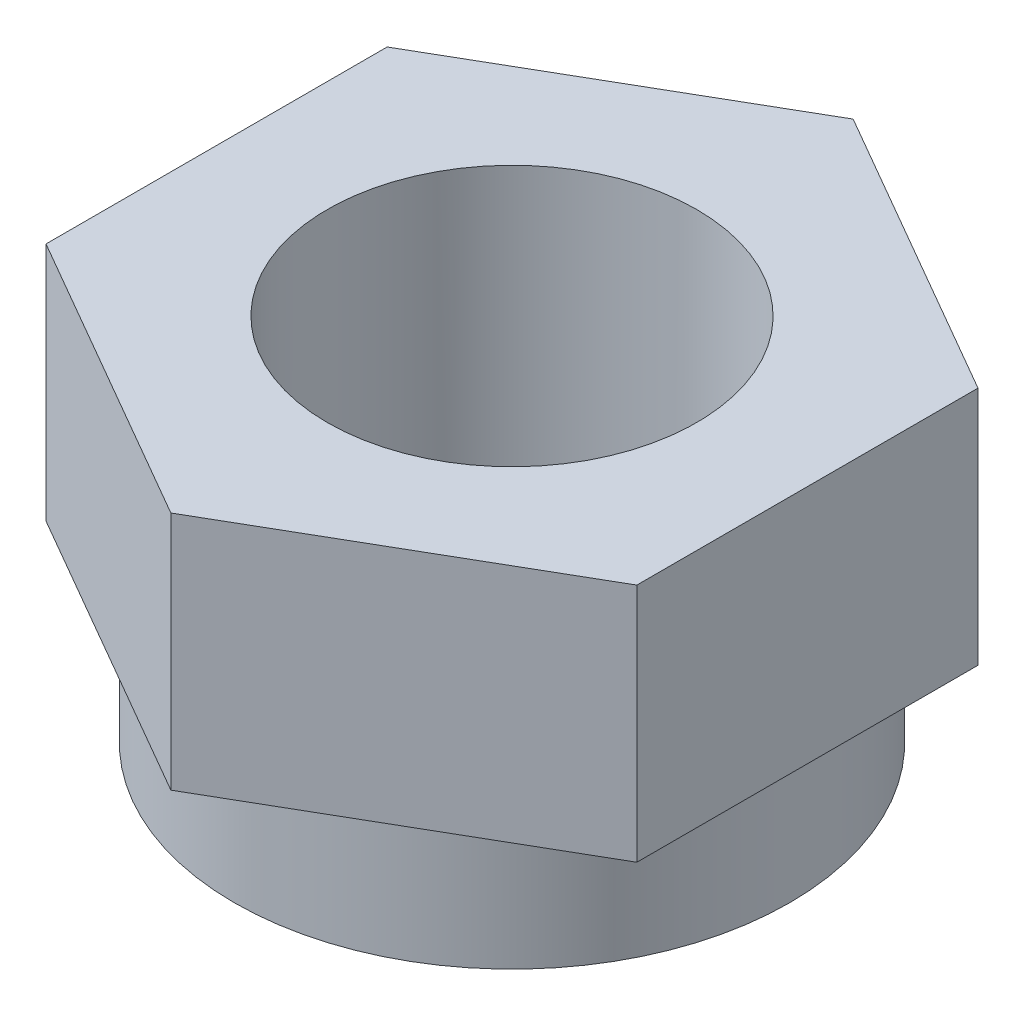
ISO-10303-21;
HEADER;
FILE_DESCRIPTION(('STEP AP214'),'2;1');
FILE_NAME('part.step','',(''),(''),'','','');
FILE_SCHEMA(('AUTOMOTIVE_DESIGN { 1 0 10303 214 1 1 1 1 }'));
ENDSEC;
DATA;
#1=APPLICATION_CONTEXT('core data for automotive mechanical design processes');
#2=APPLICATION_PROTOCOL_DEFINITION('international standard','automotive_design',2000,#1);
#3=PRODUCT_CONTEXT('',#1,'mechanical');
#4=PRODUCT('Part','Part','',(#3));
#5=PRODUCT_RELATED_PRODUCT_CATEGORY('part','',(#4));
#6=PRODUCT_DEFINITION_FORMATION('','',#4);
#7=PRODUCT_DEFINITION_CONTEXT('part definition',#1,'design');
#8=PRODUCT_DEFINITION('design','',#6,#7);
#9=PRODUCT_DEFINITION_SHAPE('','',#8);
#10=(LENGTH_UNIT() NAMED_UNIT(*) SI_UNIT(.MILLI.,.METRE.));
#11=(NAMED_UNIT(*) PLANE_ANGLE_UNIT() SI_UNIT($,.RADIAN.));
#12=(NAMED_UNIT(*) SI_UNIT($,.STERADIAN.) SOLID_ANGLE_UNIT());
#13=UNCERTAINTY_MEASURE_WITH_UNIT(LENGTH_MEASURE(1.E-05),#10,'distance_accuracy_value','');
#14=(GEOMETRIC_REPRESENTATION_CONTEXT(3) GLOBAL_UNCERTAINTY_ASSIGNED_CONTEXT((#13)) GLOBAL_UNIT_ASSIGNED_CONTEXT((#10,
#11,#12)) REPRESENTATION_CONTEXT('',''));
#15=CARTESIAN_POINT('',(0.,0.,0.));
#16=DIRECTION('',(0.,0.,1.));
#17=DIRECTION('',(1.,0.,0.));
#18=AXIS2_PLACEMENT_3D('',#15,#16,#17);
#19=CARTESIAN_POINT('',(4.,-3.25,-2.3094010767585));
#20=DIRECTION('',(1.,0.,0.));
#21=DIRECTION('',(0.,0.,-1.));
#22=AXIS2_PLACEMENT_3D('',#19,#20,#21);
#23=PLANE('',#22);
#24=DIRECTION('',(0.,0.,-1.));
#25=VECTOR('',#24,1.);
#26=CARTESIAN_POINT('',(4.,0.,-2.3094010767585));
#27=LINE('',#26,#25);
#28=CARTESIAN_POINT('',(4.,0.,2.3094010767585));
#29=VERTEX_POINT('',#28);
#30=CARTESIAN_POINT('',(4.,0.,-2.3094010767585));
#31=VERTEX_POINT('',#30);
#32=EDGE_CURVE('E126',#29,#31,#27,.T.);
#33=ORIENTED_EDGE('',*,*,#32,.F.);
#34=DIRECTION('',(0.,1.,0.));
#35=VECTOR('',#34,1.);
#36=CARTESIAN_POINT('',(4.,-3.25,2.3094010767585));
#37=LINE('',#36,#35);
#38=CARTESIAN_POINT('',(4.,-3.25,2.3094010767585));
#39=VERTEX_POINT('',#38);
#40=EDGE_CURVE('E11',#39,#29,#37,.T.);
#41=ORIENTED_EDGE('',*,*,#40,.F.);
#42=DIRECTION('',(0.,0.,-1.));
#43=VECTOR('',#42,1.);
#44=CARTESIAN_POINT('',(4.,-3.25,-2.3094010767585));
#45=LINE('',#44,#43);
#46=CARTESIAN_POINT('',(4.,-3.25,-2.3094010767585));
#47=VERTEX_POINT('',#46);
#48=EDGE_CURVE('E141',#39,#47,#45,.T.);
#49=ORIENTED_EDGE('',*,*,#48,.T.);
#50=DIRECTION('',(0.,1.,0.));
#51=VECTOR('',#50,1.);
#52=CARTESIAN_POINT('',(4.,-3.25,-2.3094010767585));
#53=LINE('',#52,#51);
#54=EDGE_CURVE('E44',#47,#31,#53,.T.);
#55=ORIENTED_EDGE('',*,*,#54,.T.);
#56=EDGE_LOOP('',(#33,#41,#49,#55));
#57=FACE_BOUND('',#56,.T.);
#58=ADVANCED_FACE('F41',(#57),#23,.T.);
#59=CARTESIAN_POINT('',(4.,-3.25,2.3094010767585));
#60=DIRECTION('',(0.5,0.,0.866025403784439));
#61=DIRECTION('',(0.866025403784439,0.,-0.5));
#62=AXIS2_PLACEMENT_3D('',#59,#60,#61);
#63=PLANE('',#62);
#64=DIRECTION('',(0.866025403784439,0.,-0.5));
#65=VECTOR('',#64,1.);
#66=CARTESIAN_POINT('',(4.,0.,2.3094010767585));
#67=LINE('',#66,#65);
#68=CARTESIAN_POINT('',(0.,0.,4.61880215351701));
#69=VERTEX_POINT('',#68);
#70=EDGE_CURVE('E139',#69,#29,#67,.T.);
#71=ORIENTED_EDGE('',*,*,#70,.F.);
#72=DIRECTION('',(0.,1.,0.));
#73=VECTOR('',#72,1.);
#74=CARTESIAN_POINT('',(0.,-3.25,4.61880215351701));
#75=LINE('',#74,#73);
#76=CARTESIAN_POINT('',(0.,-3.25,4.61880215351701));
#77=VERTEX_POINT('',#76);
#78=EDGE_CURVE('E50',#77,#69,#75,.T.);
#79=ORIENTED_EDGE('',*,*,#78,.F.);
#80=DIRECTION('',(0.866025403784439,0.,-0.5));
#81=VECTOR('',#80,1.);
#82=CARTESIAN_POINT('',(4.,-3.25,2.3094010767585));
#83=LINE('',#82,#81);
#84=EDGE_CURVE('E116',#77,#39,#83,.T.);
#85=ORIENTED_EDGE('',*,*,#84,.T.);
#86=ORIENTED_EDGE('',*,*,#40,.T.);
#87=EDGE_LOOP('',(#71,#79,#85,#86));
#88=FACE_BOUND('',#87,.T.);
#89=ADVANCED_FACE('F149',(#88),#63,.T.);
#90=CARTESIAN_POINT('',(0.,-3.25,4.61880215351701));
#91=DIRECTION('',(-0.5,0.,0.866025403784439));
#92=DIRECTION('',(0.866025403784439,0.,0.5));
#93=AXIS2_PLACEMENT_3D('',#90,#91,#92);
#94=PLANE('',#93);
#95=DIRECTION('',(0.866025403784439,0.,0.5));
#96=VECTOR('',#95,1.);
#97=CARTESIAN_POINT('',(0.,0.,4.61880215351701));
#98=LINE('',#97,#96);
#99=CARTESIAN_POINT('',(-4.,0.,2.3094010767585));
#100=VERTEX_POINT('',#99);
#101=EDGE_CURVE('E103',#100,#69,#98,.T.);
#102=ORIENTED_EDGE('',*,*,#101,.F.);
#103=DIRECTION('',(0.,1.,0.));
#104=VECTOR('',#103,1.);
#105=CARTESIAN_POINT('',(-4.,-3.25,2.3094010767585));
#106=LINE('',#105,#104);
#107=CARTESIAN_POINT('',(-4.,-3.25,2.3094010767585));
#108=VERTEX_POINT('',#107);
#109=EDGE_CURVE('E98',#108,#100,#106,.T.);
#110=ORIENTED_EDGE('',*,*,#109,.F.);
#111=DIRECTION('',(0.866025403784439,0.,0.5));
#112=VECTOR('',#111,1.);
#113=CARTESIAN_POINT('',(0.,-3.25,4.61880215351701));
#114=LINE('',#113,#112);
#115=EDGE_CURVE('E101',#108,#77,#114,.T.);
#116=ORIENTED_EDGE('',*,*,#115,.T.);
#117=ORIENTED_EDGE('',*,*,#78,.T.);
#118=EDGE_LOOP('',(#102,#110,#116,#117));
#119=FACE_BOUND('',#118,.T.);
#120=ADVANCED_FACE('F100',(#119),#94,.T.);
#121=CARTESIAN_POINT('',(-4.,-3.25,2.3094010767585));
#122=DIRECTION('',(-1.,0.,0.));
#123=DIRECTION('',(0.,0.,1.));
#124=AXIS2_PLACEMENT_3D('',#121,#122,#123);
#125=PLANE('',#124);
#126=DIRECTION('',(0.,0.,1.));
#127=VECTOR('',#126,1.);
#128=CARTESIAN_POINT('',(-4.,0.,2.3094010767585));
#129=LINE('',#128,#127);
#130=CARTESIAN_POINT('',(-4.,0.,-2.3094010767585));
#131=VERTEX_POINT('',#130);
#132=EDGE_CURVE('E136',#131,#100,#129,.T.);
#133=ORIENTED_EDGE('',*,*,#132,.F.);
#134=DIRECTION('',(0.,1.,0.));
#135=VECTOR('',#134,1.);
#136=CARTESIAN_POINT('',(-4.,-3.25,-2.3094010767585));
#137=LINE('',#136,#135);
#138=CARTESIAN_POINT('',(-4.,-3.25,-2.3094010767585));
#139=VERTEX_POINT('',#138);
#140=EDGE_CURVE('E108',#139,#131,#137,.T.);
#141=ORIENTED_EDGE('',*,*,#140,.F.);
#142=DIRECTION('',(0.,0.,1.));
#143=VECTOR('',#142,1.);
#144=CARTESIAN_POINT('',(-4.,-3.25,2.3094010767585));
#145=LINE('',#144,#143);
#146=EDGE_CURVE('E114',#139,#108,#145,.T.);
#147=ORIENTED_EDGE('',*,*,#146,.T.);
#148=ORIENTED_EDGE('',*,*,#109,.T.);
#149=EDGE_LOOP('',(#133,#141,#147,#148));
#150=FACE_BOUND('',#149,.T.);
#151=ADVANCED_FACE('F118',(#150),#125,.T.);
#152=CARTESIAN_POINT('',(-4.,-3.25,-2.3094010767585));
#153=DIRECTION('',(-0.5,0.,-0.866025403784438));
#154=DIRECTION('',(-0.866025403784439,0.,0.5));
#155=AXIS2_PLACEMENT_3D('',#152,#153,#154);
#156=PLANE('',#155);
#157=DIRECTION('',(-0.866025403784439,0.,0.5));
#158=VECTOR('',#157,1.);
#159=CARTESIAN_POINT('',(-4.,0.,-2.3094010767585));
#160=LINE('',#159,#158);
#161=CARTESIAN_POINT('',(0.,0.,-4.61880215351701));
#162=VERTEX_POINT('',#161);
#163=EDGE_CURVE('E133',#162,#131,#160,.T.);
#164=ORIENTED_EDGE('',*,*,#163,.F.);
#165=DIRECTION('',(0.,1.,0.));
#166=VECTOR('',#165,1.);
#167=CARTESIAN_POINT('',(0.,-3.25,-4.61880215351701));
#168=LINE('',#167,#166);
#169=CARTESIAN_POINT('',(0.,-3.25,-4.61880215351701));
#170=VERTEX_POINT('',#169);
#171=EDGE_CURVE('E144',#170,#162,#168,.T.);
#172=ORIENTED_EDGE('',*,*,#171,.F.);
#173=DIRECTION('',(-0.866025403784439,0.,0.5));
#174=VECTOR('',#173,1.);
#175=CARTESIAN_POINT('',(-4.,-3.25,-2.3094010767585));
#176=LINE('',#175,#174);
#177=EDGE_CURVE('E119',#170,#139,#176,.T.);
#178=ORIENTED_EDGE('',*,*,#177,.T.);
#179=ORIENTED_EDGE('',*,*,#140,.T.);
#180=EDGE_LOOP('',(#164,#172,#178,#179));
#181=FACE_BOUND('',#180,.T.);
#182=ADVANCED_FACE('F162',(#181),#156,.T.);
#183=CARTESIAN_POINT('',(0.,-3.25,-4.61880215351701));
#184=DIRECTION('',(0.5,0.,-0.866025403784438));
#185=DIRECTION('',(-0.866025403784439,0.,-0.5));
#186=AXIS2_PLACEMENT_3D('',#183,#184,#185);
#187=PLANE('',#186);
#188=DIRECTION('',(-0.866025403784438,0.,-0.5));
#189=VECTOR('',#188,1.);
#190=CARTESIAN_POINT('',(0.,0.,-4.61880215351701));
#191=LINE('',#190,#189);
#192=EDGE_CURVE('E129',#31,#162,#191,.T.);
#193=ORIENTED_EDGE('',*,*,#192,.F.);
#194=ORIENTED_EDGE('',*,*,#54,.F.);
#195=DIRECTION('',(-0.866025403784438,0.,-0.5));
#196=VECTOR('',#195,1.);
#197=CARTESIAN_POINT('',(0.,-3.25,-4.61880215351701));
#198=LINE('',#197,#196);
#199=EDGE_CURVE('E121',#47,#170,#198,.T.);
#200=ORIENTED_EDGE('',*,*,#199,.T.);
#201=ORIENTED_EDGE('',*,*,#171,.T.);
#202=EDGE_LOOP('',(#193,#194,#200,#201));
#203=FACE_BOUND('',#202,.T.);
#204=ADVANCED_FACE('F146',(#203),#187,.T.);
#205=CARTESIAN_POINT('',(0.,-3.25,0.));
#206=DIRECTION('',(0.,-1.,0.));
#207=DIRECTION('',(0.,0.,-1.));
#208=AXIS2_PLACEMENT_3D('',#205,#206,#207);
#209=PLANE('',#208);
#210=CARTESIAN_POINT('',(0.,-3.25,0.));
#211=DIRECTION('',(0.,1.,0.));
#212=DIRECTION('',(0.,0.,1.));
#213=AXIS2_PLACEMENT_3D('',#210,#211,#212);
#214=CIRCLE('',#213,3.76);
#215=CARTESIAN_POINT('',(0.,-3.25,3.76));
#216=VERTEX_POINT('',#215);
#217=EDGE_CURVE('E196',#216,#216,#214,.T.);
#218=ORIENTED_EDGE('',*,*,#217,.T.);
#219=EDGE_LOOP('',(#218));
#220=FACE_BOUND('',#219,.T.);
#221=ORIENTED_EDGE('',*,*,#48,.F.);
#222=ORIENTED_EDGE('',*,*,#84,.F.);
#223=ORIENTED_EDGE('',*,*,#115,.F.);
#224=ORIENTED_EDGE('',*,*,#146,.F.);
#225=ORIENTED_EDGE('',*,*,#177,.F.);
#226=ORIENTED_EDGE('',*,*,#199,.F.);
#227=EDGE_LOOP('',(#221,#222,#223,#224,#225,#226));
#228=FACE_BOUND('',#227,.T.);
#229=ADVANCED_FACE('F112',(#220,#228),#209,.T.);
#230=CARTESIAN_POINT('',(0.,0.,0.));
#231=DIRECTION('',(0.,-1.,0.));
#232=DIRECTION('',(0.,0.,-1.));
#233=AXIS2_PLACEMENT_3D('',#230,#231,#232);
#234=PLANE('',#233);
#235=CARTESIAN_POINT('',(0.,0.,0.));
#236=DIRECTION('',(0.,-1.,0.));
#237=DIRECTION('',(0.,0.,-1.));
#238=AXIS2_PLACEMENT_3D('',#235,#236,#237);
#239=CIRCLE('',#238,2.5);
#240=CARTESIAN_POINT('',(0.,0.,-2.5));
#241=VERTEX_POINT('',#240);
#242=EDGE_CURVE('E195',#241,#241,#239,.T.);
#243=ORIENTED_EDGE('',*,*,#242,.T.);
#244=EDGE_LOOP('',(#243));
#245=FACE_BOUND('',#244,.T.);
#246=ORIENTED_EDGE('',*,*,#32,.T.);
#247=ORIENTED_EDGE('',*,*,#192,.T.);
#248=ORIENTED_EDGE('',*,*,#163,.T.);
#249=ORIENTED_EDGE('',*,*,#132,.T.);
#250=ORIENTED_EDGE('',*,*,#101,.T.);
#251=ORIENTED_EDGE('',*,*,#70,.T.);
#252=EDGE_LOOP('',(#246,#247,#248,#249,#250,#251));
#253=FACE_BOUND('',#252,.T.);
#254=ADVANCED_FACE('F148',(#245,#253),#234,.F.);
#255=CARTESIAN_POINT('',(0.,-5.,0.));
#256=DIRECTION('',(0.,1.,0.));
#257=DIRECTION('',(0.,0.,1.));
#258=AXIS2_PLACEMENT_3D('',#255,#256,#257);
#259=CYLINDRICAL_SURFACE('',#258,3.76);
#260=CARTESIAN_POINT('',(0.,-5.,0.));
#261=DIRECTION('',(0.,1.,0.));
#262=DIRECTION('',(0.,0.,1.));
#263=AXIS2_PLACEMENT_3D('',#260,#261,#262);
#264=CIRCLE('',#263,3.76);
#265=CARTESIAN_POINT('',(0.,-5.,3.76));
#266=VERTEX_POINT('',#265);
#267=EDGE_CURVE('E130',#266,#266,#264,.T.);
#268=CARTESIAN_POINT('',(0.,-5.,3.76));
#269=CARTESIAN_POINT('',(0.,-4.98177083333333,3.76));
#270=CARTESIAN_POINT('',(0.,-4.96354166666667,3.76));
#271=CARTESIAN_POINT('',(0.,-4.92708333333333,3.76));
#272=CARTESIAN_POINT('',(0.,-4.90885416666667,3.76));
#273=CARTESIAN_POINT('',(0.,-4.87239583333333,3.76));
#274=CARTESIAN_POINT('',(0.,-4.85416666666667,3.76));
#275=CARTESIAN_POINT('',(0.,-4.81770833333333,3.76));
#276=CARTESIAN_POINT('',(0.,-4.79947916666667,3.76));
#277=CARTESIAN_POINT('',(0.,-4.76302083333333,3.76));
#278=CARTESIAN_POINT('',(0.,-4.74479166666667,3.76));
#279=CARTESIAN_POINT('',(0.,-4.70833333333333,3.76));
#280=CARTESIAN_POINT('',(0.,-4.69010416666667,3.76));
#281=CARTESIAN_POINT('',(0.,-4.65364583333333,3.76));
#282=CARTESIAN_POINT('',(0.,-4.63541666666667,3.76));
#283=CARTESIAN_POINT('',(0.,-4.59895833333333,3.76));
#284=CARTESIAN_POINT('',(0.,-4.58072916666667,3.76));
#285=CARTESIAN_POINT('',(0.,-4.54427083333333,3.76));
#286=CARTESIAN_POINT('',(0.,-4.52604166666667,3.76));
#287=CARTESIAN_POINT('',(0.,-4.48958333333333,3.76));
#288=CARTESIAN_POINT('',(0.,-4.47135416666667,3.76));
#289=CARTESIAN_POINT('',(0.,-4.43489583333333,3.76));
#290=CARTESIAN_POINT('',(0.,-4.41666666666667,3.76));
#291=CARTESIAN_POINT('',(0.,-4.38020833333333,3.76));
#292=CARTESIAN_POINT('',(0.,-4.36197916666667,3.76));
#293=CARTESIAN_POINT('',(0.,-4.32552083333333,3.76));
#294=CARTESIAN_POINT('',(0.,-4.30729166666667,3.76));
#295=CARTESIAN_POINT('',(0.,-4.27083333333333,3.76));
#296=CARTESIAN_POINT('',(0.,-4.25260416666667,3.76));
#297=CARTESIAN_POINT('',(0.,-4.21614583333333,3.76));
#298=CARTESIAN_POINT('',(0.,-4.19791666666667,3.76));
#299=CARTESIAN_POINT('',(0.,-4.16145833333333,3.76));
#300=CARTESIAN_POINT('',(0.,-4.14322916666667,3.76));
#301=CARTESIAN_POINT('',(0.,-4.10677083333333,3.76));
#302=CARTESIAN_POINT('',(0.,-4.08854166666667,3.76));
#303=CARTESIAN_POINT('',(0.,-4.05208333333333,3.76));
#304=CARTESIAN_POINT('',(0.,-4.03385416666667,3.76));
#305=CARTESIAN_POINT('',(0.,-3.99739583333333,3.76));
#306=CARTESIAN_POINT('',(0.,-3.97916666666667,3.76));
#307=CARTESIAN_POINT('',(0.,-3.94270833333333,3.76));
#308=CARTESIAN_POINT('',(0.,-3.92447916666667,3.76));
#309=CARTESIAN_POINT('',(0.,-3.88802083333333,3.76));
#310=CARTESIAN_POINT('',(0.,-3.86979166666667,3.76));
#311=CARTESIAN_POINT('',(0.,-3.83333333333333,3.76));
#312=CARTESIAN_POINT('',(0.,-3.81510416666667,3.76));
#313=CARTESIAN_POINT('',(0.,-3.77864583333333,3.76));
#314=CARTESIAN_POINT('',(0.,-3.76041666666667,3.76));
#315=CARTESIAN_POINT('',(0.,-3.72395833333333,3.76));
#316=CARTESIAN_POINT('',(0.,-3.70572916666667,3.76));
#317=CARTESIAN_POINT('',(0.,-3.66927083333333,3.76));
#318=CARTESIAN_POINT('',(0.,-3.65104166666667,3.76));
#319=CARTESIAN_POINT('',(0.,-3.61458333333333,3.76));
#320=CARTESIAN_POINT('',(0.,-3.59635416666667,3.76));
#321=CARTESIAN_POINT('',(0.,-3.55989583333333,3.76));
#322=CARTESIAN_POINT('',(0.,-3.54166666666667,3.76));
#323=CARTESIAN_POINT('',(0.,-3.50520833333333,3.76));
#324=CARTESIAN_POINT('',(0.,-3.48697916666667,3.76));
#325=CARTESIAN_POINT('',(0.,-3.45052083333333,3.76));
#326=CARTESIAN_POINT('',(0.,-3.43229166666667,3.76));
#327=CARTESIAN_POINT('',(0.,-3.39583333333333,3.76));
#328=CARTESIAN_POINT('',(0.,-3.37760416666667,3.76));
#329=CARTESIAN_POINT('',(0.,-3.34114583333333,3.76));
#330=CARTESIAN_POINT('',(0.,-3.32291666666667,3.76));
#331=CARTESIAN_POINT('',(0.,-3.28645833333333,3.76));
#332=CARTESIAN_POINT('',(0.,-3.26822916666667,3.76));
#333=CARTESIAN_POINT('',(0.,-3.25,3.76));
#334=B_SPLINE_CURVE_WITH_KNOTS('',3,(#268,#269,#270,#271,#272,#273,#274,#275,#276,#277,#278,
#279,#280,#281,#282,#283,#284,#285,#286,#287,#288,#289,#290,#291,#292,#293,#294,#295,#296,#297,
#298,#299,#300,#301,#302,#303,#304,#305,#306,#307,#308,#309,#310,#311,#312,#313,#314,#315,#316,
#317,#318,#319,#320,#321,#322,#323,#324,#325,#326,#327,#328,#329,#330,#331,#332,#333),
.UNSPECIFIED.,.F.,.F.,(4,2,2,2,2,2,2,2,2,2,2,2,2,2,2,2,2,2,2,2,2,2,2,2,2,2,2,2,2,2,2,2,4),(0.,
0.0546874999999992,0.109374999999999,0.164062499999999,0.218749999999999,0.273437499999999,
0.328124999999999,0.382812499999999,0.4375,0.4921875,0.546875,0.6015625,0.65625,0.7109375,
0.765625,0.8203125,0.875,0.9296875,0.984375,1.0390625,1.09375,1.1484375,1.203125,1.2578125,
1.3125,1.3671875,1.421875,1.4765625,1.53125,1.5859375,1.640625,1.6953125,1.75),.UNSPECIFIED.);
#335=EDGE_CURVE('BSEAM174',#266,#216,#334,.T.);
#336=ORIENTED_EDGE('',*,*,#267,.T.);
#337=ORIENTED_EDGE('',*,*,#217,.F.);
#338=ORIENTED_EDGE('',*,*,#335,.T.);
#339=ORIENTED_EDGE('',*,*,#335,.F.);
#340=EDGE_LOOP('',(#336,#338,#337,#339));
#341=FACE_BOUND('',#340,.T.);
#342=ADVANCED_FACE('F174',(#341),#259,.T.);
#343=CARTESIAN_POINT('',(0.,-5.,0.));
#344=DIRECTION('',(0.,1.,0.));
#345=DIRECTION('',(0.,0.,1.));
#346=AXIS2_PLACEMENT_3D('',#343,#344,#345);
#347=PLANE('',#346);
#348=CARTESIAN_POINT('',(0.,-5.,0.));
#349=DIRECTION('',(0.,1.,0.));
#350=DIRECTION('',(0.,0.,1.));
#351=AXIS2_PLACEMENT_3D('',#348,#349,#350);
#352=CIRCLE('',#351,2.5);
#353=CARTESIAN_POINT('',(0.,-5.,2.5));
#354=VERTEX_POINT('',#353);
#355=EDGE_CURVE('E192',#354,#354,#352,.T.);
#356=ORIENTED_EDGE('',*,*,#355,.T.);
#357=EDGE_LOOP('',(#356));
#358=FACE_BOUND('',#357,.T.);
#359=ORIENTED_EDGE('',*,*,#267,.F.);
#360=EDGE_LOOP('',(#359));
#361=FACE_BOUND('',#360,.T.);
#362=ADVANCED_FACE('F179',(#358,#361),#347,.F.);
#363=CARTESIAN_POINT('',(0.,-5.,0.));
#364=DIRECTION('',(0.,1.,0.));
#365=DIRECTION('',(0.,0.,1.));
#366=AXIS2_PLACEMENT_3D('',#363,#364,#365);
#367=CYLINDRICAL_SURFACE('',#366,2.5);
#368=ORIENTED_EDGE('',*,*,#355,.F.);
#369=EDGE_LOOP('',(#368));
#370=FACE_BOUND('',#369,.T.);
#371=ORIENTED_EDGE('',*,*,#242,.F.);
#372=EDGE_LOOP('',(#371));
#373=FACE_BOUND('',#372,.T.);
#374=ADVANCED_FACE('F183',(#370,#373),#367,.F.);
#375=CLOSED_SHELL('',(#58,#89,#120,#151,#182,#204,#229,#254,#342,#362,#374));
#376=MANIFOLD_SOLID_BREP('B2',#375);
#377=ADVANCED_BREP_SHAPE_REPRESENTATION('',(#18,#376),#14);
#378=SHAPE_DEFINITION_REPRESENTATION(#9,#377);
ENDSEC;
END-ISO-10303-21;
